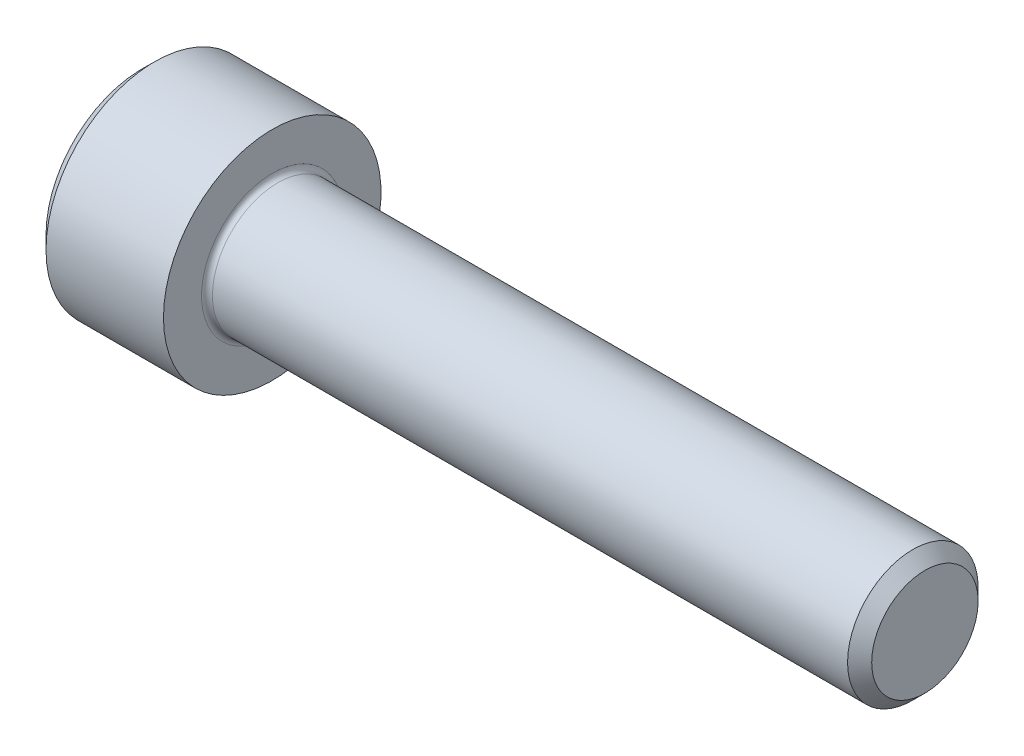
ISO-10303-21;
HEADER;
FILE_DESCRIPTION(('STEP AP214'),'2;1');
FILE_NAME('part.step','',(''),(''),'','','');
FILE_SCHEMA(('AUTOMOTIVE_DESIGN { 1 0 10303 214 1 1 1 1 }'));
ENDSEC;
DATA;
#1=APPLICATION_CONTEXT('core data for automotive mechanical design processes');
#2=APPLICATION_PROTOCOL_DEFINITION('international standard','automotive_design',2000,#1);
#3=PRODUCT_CONTEXT('',#1,'mechanical');
#4=PRODUCT('Part','Part','',(#3));
#5=PRODUCT_RELATED_PRODUCT_CATEGORY('part','',(#4));
#6=PRODUCT_DEFINITION_FORMATION('','',#4);
#7=PRODUCT_DEFINITION_CONTEXT('part definition',#1,'design');
#8=PRODUCT_DEFINITION('design','',#6,#7);
#9=PRODUCT_DEFINITION_SHAPE('','',#8);
#10=(LENGTH_UNIT() NAMED_UNIT(*) SI_UNIT(.MILLI.,.METRE.));
#11=(NAMED_UNIT(*) PLANE_ANGLE_UNIT() SI_UNIT($,.RADIAN.));
#12=(NAMED_UNIT(*) SI_UNIT($,.STERADIAN.) SOLID_ANGLE_UNIT());
#13=UNCERTAINTY_MEASURE_WITH_UNIT(LENGTH_MEASURE(1.E-05),#10,'distance_accuracy_value','');
#14=(GEOMETRIC_REPRESENTATION_CONTEXT(3) GLOBAL_UNCERTAINTY_ASSIGNED_CONTEXT((#13)) GLOBAL_UNIT_ASSIGNED_CONTEXT((#10,
#11,#12)) REPRESENTATION_CONTEXT('',''));
#15=CARTESIAN_POINT('',(0.,0.,0.));
#16=DIRECTION('',(0.,0.,1.));
#17=DIRECTION('',(1.,0.,0.));
#18=AXIS2_PLACEMENT_3D('',#15,#16,#17);
#19=CARTESIAN_POINT('',(0.,0.,0.));
#20=DIRECTION('',(-1.,0.,0.));
#21=DIRECTION('',(0.,0.,1.));
#22=AXIS2_PLACEMENT_3D('',#19,#20,#21);
#23=PLANE('',#22);
#24=DIRECTION('',(0.,-0.5,0.866025403784439));
#25=VECTOR('',#24,1.);
#26=CARTESIAN_POINT('',(0.,2.93524876856006,0.));
#27=LINE('',#26,#25);
#28=CARTESIAN_POINT('',(0.,2.93524876856006,0.));
#29=VERTEX_POINT('',#28);
#30=CARTESIAN_POINT('',(0.,1.46762438428003,2.542));
#31=VERTEX_POINT('',#30);
#32=EDGE_CURVE('E387',#29,#31,#27,.T.);
#33=ORIENTED_EDGE('',*,*,#32,.T.);
#34=DIRECTION('',(0.,1.,0.));
#35=VECTOR('',#34,1.);
#36=CARTESIAN_POINT('',(0.,-1.46762438428003,2.542));
#37=LINE('',#36,#35);
#38=CARTESIAN_POINT('',(0.,-1.46762438428003,2.542));
#39=VERTEX_POINT('',#38);
#40=EDGE_CURVE('E136',#39,#31,#37,.T.);
#41=ORIENTED_EDGE('',*,*,#40,.F.);
#42=DIRECTION('',(0.,-0.500000000000001,-0.866025403784438));
#43=VECTOR('',#42,1.);
#44=CARTESIAN_POINT('',(0.,-1.46762438428003,2.542));
#45=LINE('',#44,#43);
#46=CARTESIAN_POINT('',(0.,-2.93524876856006,0.));
#47=VERTEX_POINT('',#46);
#48=EDGE_CURVE('E390',#39,#47,#45,.T.);
#49=ORIENTED_EDGE('',*,*,#48,.T.);
#50=DIRECTION('',(0.,0.5,-0.866025403784439));
#51=VECTOR('',#50,1.);
#52=CARTESIAN_POINT('',(0.,-2.93524876856006,0.));
#53=LINE('',#52,#51);
#54=CARTESIAN_POINT('',(0.,-1.46762438428003,-2.542));
#55=VERTEX_POINT('',#54);
#56=EDGE_CURVE('E393',#47,#55,#53,.T.);
#57=ORIENTED_EDGE('',*,*,#56,.T.);
#58=DIRECTION('',(0.,-1.,0.));
#59=VECTOR('',#58,1.);
#60=CARTESIAN_POINT('',(0.,1.46762438428003,-2.542));
#61=LINE('',#60,#59);
#62=CARTESIAN_POINT('',(0.,1.46762438428003,-2.542));
#63=VERTEX_POINT('',#62);
#64=EDGE_CURVE('E396',#63,#55,#61,.T.);
#65=ORIENTED_EDGE('',*,*,#64,.F.);
#66=DIRECTION('',(0.,-0.500000000000001,-0.866025403784438));
#67=VECTOR('',#66,1.);
#68=CARTESIAN_POINT('',(0.,2.93524876856006,0.));
#69=LINE('',#68,#67);
#70=EDGE_CURVE('E131',#29,#63,#69,.T.);
#71=ORIENTED_EDGE('',*,*,#70,.F.);
#72=EDGE_LOOP('',(#33,#41,#49,#57,#65,#71));
#73=FACE_BOUND('',#72,.T.);
#74=CARTESIAN_POINT('',(0.,0.,0.));
#75=DIRECTION('',(-1.,0.,0.));
#76=DIRECTION('',(0.,0.,1.));
#77=AXIS2_PLACEMENT_3D('',#74,#75,#76);
#78=CIRCLE('',#77,4.4);
#79=CARTESIAN_POINT('',(0.,0.,4.4));
#80=VERTEX_POINT('',#79);
#81=EDGE_CURVE('E147',#80,#80,#78,.T.);
#82=ORIENTED_EDGE('',*,*,#81,.T.);
#83=EDGE_LOOP('',(#82));
#84=FACE_BOUND('',#83,.T.);
#85=ADVANCED_FACE('F40',(#73,#84),#23,.T.);
#86=CARTESIAN_POINT('',(36.,2.4455,0.));
#87=DIRECTION('',(1.,0.,0.));
#88=DIRECTION('',(0.,0.,-1.));
#89=AXIS2_PLACEMENT_3D('',#86,#87,#88);
#90=PLANE('',#89);
#91=CARTESIAN_POINT('',(36.,0.,0.));
#92=DIRECTION('',(-1.,0.,0.));
#93=DIRECTION('',(0.,0.,1.));
#94=AXIS2_PLACEMENT_3D('',#91,#92,#93);
#95=CIRCLE('',#94,2.4455);
#96=CARTESIAN_POINT('',(36.,0.,2.4455));
#97=VERTEX_POINT('',#96);
#98=EDGE_CURVE('E160',#97,#97,#95,.T.);
#99=ORIENTED_EDGE('',*,*,#98,.F.);
#100=EDGE_LOOP('',(#99));
#101=FACE_BOUND('',#100,.T.);
#102=ADVANCED_FACE('F182',(#101),#90,.T.);
#103=CARTESIAN_POINT('',(36.,0.,0.));
#104=DIRECTION('',(-1.,0.,0.));
#105=DIRECTION('',(0.,0.,1.));
#106=AXIS2_PLACEMENT_3D('',#103,#104,#105);
#107=CONICAL_SURFACE('',#106,2.4455,0.785398163397553);
#108=CARTESIAN_POINT('',(35.4455000000001,0.,0.));
#109=DIRECTION('',(-1.,0.,0.));
#110=DIRECTION('',(0.,0.,1.));
#111=AXIS2_PLACEMENT_3D('',#108,#109,#110);
#112=CIRCLE('',#111,3.00000000000005);
#113=CARTESIAN_POINT('',(35.4455000000001,0.,3.00000000000005));
#114=VERTEX_POINT('',#113);
#115=EDGE_CURVE('E157',#114,#114,#112,.T.);
#116=ORIENTED_EDGE('',*,*,#115,.F.);
#117=EDGE_LOOP('',(#116));
#118=FACE_BOUND('',#117,.T.);
#119=ORIENTED_EDGE('',*,*,#98,.T.);
#120=EDGE_LOOP('',(#119));
#121=FACE_BOUND('',#120,.T.);
#122=ADVANCED_FACE('F188',(#118,#121),#107,.T.);
#123=CARTESIAN_POINT('',(-31.75,0.,0.));
#124=DIRECTION('',(-1.,0.,0.));
#125=DIRECTION('',(0.,0.,1.));
#126=AXIS2_PLACEMENT_3D('',#123,#124,#125);
#127=CYLINDRICAL_SURFACE('',#126,3.00000000000002);
#128=CARTESIAN_POINT('',(6.25,0.,0.));
#129=DIRECTION('',(1.,0.,0.));
#130=DIRECTION('',(0.,0.,-1.));
#131=AXIS2_PLACEMENT_3D('',#128,#129,#130);
#132=CIRCLE('',#131,3.00000000000002);
#133=CARTESIAN_POINT('',(6.25,0.,-3.00000000000002));
#134=VERTEX_POINT('',#133);
#135=EDGE_CURVE('E11',#134,#134,#132,.T.);
#136=ORIENTED_EDGE('',*,*,#135,.T.);
#137=EDGE_LOOP('',(#136));
#138=FACE_BOUND('',#137,.T.);
#139=ORIENTED_EDGE('',*,*,#115,.T.);
#140=EDGE_LOOP('',(#139));
#141=FACE_BOUND('',#140,.T.);
#142=ADVANCED_FACE('F198',(#138,#141),#127,.T.);
#143=CARTESIAN_POINT('',(6.,5.,0.));
#144=DIRECTION('',(1.,0.,0.));
#145=DIRECTION('',(0.,0.,-1.));
#146=AXIS2_PLACEMENT_3D('',#143,#144,#145);
#147=PLANE('',#146);
#148=CARTESIAN_POINT('',(6.,0.,0.));
#149=DIRECTION('',(1.,0.,0.));
#150=DIRECTION('',(0.,0.,-1.));
#151=AXIS2_PLACEMENT_3D('',#148,#149,#150);
#152=CIRCLE('',#151,3.25000000000002);
#153=CARTESIAN_POINT('',(6.,0.,-3.25000000000002));
#154=VERTEX_POINT('',#153);
#155=EDGE_CURVE('E48',#154,#154,#152,.F.);
#156=ORIENTED_EDGE('',*,*,#155,.T.);
#157=EDGE_LOOP('',(#156));
#158=FACE_BOUND('',#157,.T.);
#159=CARTESIAN_POINT('',(6.,0.,0.));
#160=DIRECTION('',(-1.,0.,0.));
#161=DIRECTION('',(0.,0.,1.));
#162=AXIS2_PLACEMENT_3D('',#159,#160,#161);
#163=CIRCLE('',#162,5.);
#164=CARTESIAN_POINT('',(6.,0.,5.));
#165=VERTEX_POINT('',#164);
#166=EDGE_CURVE('E154',#165,#165,#163,.T.);
#167=ORIENTED_EDGE('',*,*,#166,.F.);
#168=EDGE_LOOP('',(#167));
#169=FACE_BOUND('',#168,.T.);
#170=ADVANCED_FACE('F165',(#158,#169),#147,.T.);
#171=CARTESIAN_POINT('',(-31.75,0.,0.));
#172=DIRECTION('',(-1.,0.,0.));
#173=DIRECTION('',(0.,0.,1.));
#174=AXIS2_PLACEMENT_3D('',#171,#172,#173);
#175=CYLINDRICAL_SURFACE('',#174,5.);
#176=ORIENTED_EDGE('',*,*,#166,.T.);
#177=EDGE_LOOP('',(#176));
#178=FACE_BOUND('',#177,.T.);
#179=CARTESIAN_POINT('',(0.600000000000003,0.,0.));
#180=DIRECTION('',(-1.,0.,0.));
#181=DIRECTION('',(0.,0.,1.));
#182=AXIS2_PLACEMENT_3D('',#179,#180,#181);
#183=CIRCLE('',#182,5.);
#184=CARTESIAN_POINT('',(0.600000000000003,0.,5.));
#185=VERTEX_POINT('',#184);
#186=EDGE_CURVE('E151',#185,#185,#183,.T.);
#187=ORIENTED_EDGE('',*,*,#186,.F.);
#188=EDGE_LOOP('',(#187));
#189=FACE_BOUND('',#188,.T.);
#190=ADVANCED_FACE('F178',(#178,#189),#175,.T.);
#191=CARTESIAN_POINT('',(0.,0.,0.));
#192=DIRECTION('',(1.,0.,0.));
#193=DIRECTION('',(0.,0.,-1.));
#194=AXIS2_PLACEMENT_3D('',#191,#192,#193);
#195=CONICAL_SURFACE('',#194,4.4,0.785398163397446);
#196=ORIENTED_EDGE('',*,*,#186,.T.);
#197=EDGE_LOOP('',(#196));
#198=FACE_BOUND('',#197,.T.);
#199=ORIENTED_EDGE('',*,*,#81,.F.);
#200=EDGE_LOOP('',(#199));
#201=FACE_BOUND('',#200,.T.);
#202=ADVANCED_FACE('F169',(#198,#201),#195,.T.);
#203=CARTESIAN_POINT('',(6.25,0.,0.));
#204=DIRECTION('',(1.,0.,0.));
#205=DIRECTION('',(0.,0.,-1.));
#206=AXIS2_PLACEMENT_3D('',#203,#204,#205);
#207=TOROIDAL_SURFACE('',#206,3.25000000000002,0.25);
#208=ORIENTED_EDGE('',*,*,#135,.F.);
#209=EDGE_LOOP('',(#208));
#210=FACE_BOUND('',#209,.T.);
#211=ORIENTED_EDGE('',*,*,#155,.F.);
#212=EDGE_LOOP('',(#211));
#213=FACE_BOUND('',#212,.T.);
#214=ADVANCED_FACE('F42',(#210,#213),#207,.F.);
#215=CARTESIAN_POINT('',(3.,2.93524876856006,0.));
#216=DIRECTION('',(0.,-0.866025403784439,-0.5));
#217=DIRECTION('',(0.,0.5,-0.866025403784439));
#218=AXIS2_PLACEMENT_3D('',#215,#216,#217);
#219=PLANE('',#218);
#220=ORIENTED_EDGE('',*,*,#32,.F.);
#221=DIRECTION('',(-1.,0.,0.));
#222=VECTOR('',#221,1.);
#223=CARTESIAN_POINT('',(3.,2.93524876856006,0.));
#224=LINE('',#223,#222);
#225=CARTESIAN_POINT('',(3.,2.93524876856006,0.));
#226=VERTEX_POINT('',#225);
#227=EDGE_CURVE('E377',#226,#29,#224,.T.);
#228=ORIENTED_EDGE('',*,*,#227,.F.);
#229=DIRECTION('',(0.,-0.5,0.866025403784439));
#230=VECTOR('',#229,1.);
#231=CARTESIAN_POINT('',(3.,2.93524876856006,0.));
#232=LINE('',#231,#230);
#233=CARTESIAN_POINT('',(3.,2.20143657642004,1.271));
#234=VERTEX_POINT('',#233);
#235=EDGE_CURVE('E123',#226,#234,#232,.T.);
#236=ORIENTED_EDGE('',*,*,#235,.T.);
#237=CARTESIAN_POINT('',(3.,1.46762438428003,2.542));
#238=VERTEX_POINT('',#237);
#239=EDGE_CURVE('E114',#234,#238,#232,.T.);
#240=ORIENTED_EDGE('',*,*,#239,.T.);
#241=DIRECTION('',(-1.,0.,0.));
#242=VECTOR('',#241,1.);
#243=CARTESIAN_POINT('',(3.,1.46762438428003,2.542));
#244=LINE('',#243,#242);
#245=EDGE_CURVE('E128',#238,#31,#244,.T.);
#246=ORIENTED_EDGE('',*,*,#245,.T.);
#247=EDGE_LOOP('',(#220,#228,#236,#240,#246));
#248=FACE_BOUND('',#247,.T.);
#249=ADVANCED_FACE('F127',(#248),#219,.T.);
#250=CARTESIAN_POINT('',(3.,-1.46762438428003,2.542));
#251=DIRECTION('',(0.,0.,1.));
#252=DIRECTION('',(0.,-1.,0.));
#253=AXIS2_PLACEMENT_3D('',#250,#251,#252);
#254=PLANE('',#253);
#255=ORIENTED_EDGE('',*,*,#40,.T.);
#256=ORIENTED_EDGE('',*,*,#245,.F.);
#257=DIRECTION('',(0.,1.,0.));
#258=VECTOR('',#257,1.);
#259=CARTESIAN_POINT('',(3.,-1.46762438428003,2.542));
#260=LINE('',#259,#258);
#261=CARTESIAN_POINT('',(3.,0.,2.542));
#262=VERTEX_POINT('',#261);
#263=EDGE_CURVE('E111',#262,#238,#260,.T.);
#264=ORIENTED_EDGE('',*,*,#263,.F.);
#265=CARTESIAN_POINT('',(3.,-1.46762438428003,2.542));
#266=VERTEX_POINT('',#265);
#267=EDGE_CURVE('E122',#266,#262,#260,.T.);
#268=ORIENTED_EDGE('',*,*,#267,.F.);
#269=DIRECTION('',(-1.,0.,0.));
#270=VECTOR('',#269,1.);
#271=CARTESIAN_POINT('',(3.,-1.46762438428003,2.542));
#272=LINE('',#271,#270);
#273=EDGE_CURVE('E138',#266,#39,#272,.T.);
#274=ORIENTED_EDGE('',*,*,#273,.T.);
#275=EDGE_LOOP('',(#255,#256,#264,#268,#274));
#276=FACE_BOUND('',#275,.T.);
#277=ADVANCED_FACE('F133',(#276),#254,.F.);
#278=CARTESIAN_POINT('',(3.,-1.46762438428003,2.542));
#279=DIRECTION('',(0.,0.866025403784438,-0.500000000000001));
#280=DIRECTION('',(0.,0.500000000000001,0.866025403784438));
#281=AXIS2_PLACEMENT_3D('',#278,#279,#280);
#282=PLANE('',#281);
#283=ORIENTED_EDGE('',*,*,#48,.F.);
#284=ORIENTED_EDGE('',*,*,#273,.F.);
#285=DIRECTION('',(0.,-0.500000000000001,-0.866025403784438));
#286=VECTOR('',#285,1.);
#287=CARTESIAN_POINT('',(3.,-1.46762438428003,2.542));
#288=LINE('',#287,#286);
#289=CARTESIAN_POINT('',(3.,-2.20143657642004,1.271));
#290=VERTEX_POINT('',#289);
#291=EDGE_CURVE('E416',#266,#290,#288,.T.);
#292=ORIENTED_EDGE('',*,*,#291,.T.);
#293=CARTESIAN_POINT('',(3.,-2.93524876856006,0.));
#294=VERTEX_POINT('',#293);
#295=EDGE_CURVE('E405',#290,#294,#288,.T.);
#296=ORIENTED_EDGE('',*,*,#295,.T.);
#297=DIRECTION('',(-1.,0.,0.));
#298=VECTOR('',#297,1.);
#299=CARTESIAN_POINT('',(3.,-2.93524876856006,0.));
#300=LINE('',#299,#298);
#301=EDGE_CURVE('E143',#294,#47,#300,.T.);
#302=ORIENTED_EDGE('',*,*,#301,.T.);
#303=EDGE_LOOP('',(#283,#284,#292,#296,#302));
#304=FACE_BOUND('',#303,.T.);
#305=ADVANCED_FACE('F266',(#304),#282,.T.);
#306=CARTESIAN_POINT('',(3.,-2.93524876856006,0.));
#307=DIRECTION('',(0.,0.866025403784439,0.5));
#308=DIRECTION('',(0.,-0.5,0.866025403784439));
#309=AXIS2_PLACEMENT_3D('',#306,#307,#308);
#310=PLANE('',#309);
#311=ORIENTED_EDGE('',*,*,#56,.F.);
#312=ORIENTED_EDGE('',*,*,#301,.F.);
#313=DIRECTION('',(0.,0.5,-0.866025403784439));
#314=VECTOR('',#313,1.);
#315=CARTESIAN_POINT('',(3.,-2.93524876856006,0.));
#316=LINE('',#315,#314);
#317=CARTESIAN_POINT('',(3.,-2.20143657642004,-1.271));
#318=VERTEX_POINT('',#317);
#319=EDGE_CURVE('E383',#294,#318,#316,.T.);
#320=ORIENTED_EDGE('',*,*,#319,.T.);
#321=CARTESIAN_POINT('',(3.,-1.46762438428003,-2.542));
#322=VERTEX_POINT('',#321);
#323=EDGE_CURVE('E415',#318,#322,#316,.T.);
#324=ORIENTED_EDGE('',*,*,#323,.T.);
#325=DIRECTION('',(-1.,0.,0.));
#326=VECTOR('',#325,1.);
#327=CARTESIAN_POINT('',(3.,-1.46762438428003,-2.542));
#328=LINE('',#327,#326);
#329=EDGE_CURVE('E376',#322,#55,#328,.T.);
#330=ORIENTED_EDGE('',*,*,#329,.T.);
#331=EDGE_LOOP('',(#311,#312,#320,#324,#330));
#332=FACE_BOUND('',#331,.T.);
#333=ADVANCED_FACE('F274',(#332),#310,.T.);
#334=CARTESIAN_POINT('',(3.,1.46762438428003,-2.542));
#335=DIRECTION('',(0.,0.,-1.));
#336=DIRECTION('',(0.,1.,0.));
#337=AXIS2_PLACEMENT_3D('',#334,#335,#336);
#338=PLANE('',#337);
#339=ORIENTED_EDGE('',*,*,#64,.T.);
#340=ORIENTED_EDGE('',*,*,#329,.F.);
#341=DIRECTION('',(0.,-1.,0.));
#342=VECTOR('',#341,1.);
#343=CARTESIAN_POINT('',(3.,1.46762438428003,-2.542));
#344=LINE('',#343,#342);
#345=CARTESIAN_POINT('',(3.,0.,-2.542));
#346=VERTEX_POINT('',#345);
#347=EDGE_CURVE('E380',#346,#322,#344,.T.);
#348=ORIENTED_EDGE('',*,*,#347,.F.);
#349=CARTESIAN_POINT('',(3.,1.46762438428003,-2.542));
#350=VERTEX_POINT('',#349);
#351=EDGE_CURVE('E55',#350,#346,#344,.T.);
#352=ORIENTED_EDGE('',*,*,#351,.F.);
#353=DIRECTION('',(-1.,0.,0.));
#354=VECTOR('',#353,1.);
#355=CARTESIAN_POINT('',(3.,1.46762438428003,-2.542));
#356=LINE('',#355,#354);
#357=EDGE_CURVE('E373',#350,#63,#356,.T.);
#358=ORIENTED_EDGE('',*,*,#357,.T.);
#359=EDGE_LOOP('',(#339,#340,#348,#352,#358));
#360=FACE_BOUND('',#359,.T.);
#361=ADVANCED_FACE('F283',(#360),#338,.F.);
#362=CARTESIAN_POINT('',(3.,2.93524876856006,0.));
#363=DIRECTION('',(0.,0.866025403784438,-0.500000000000001));
#364=DIRECTION('',(0.,0.500000000000001,0.866025403784438));
#365=AXIS2_PLACEMENT_3D('',#362,#363,#364);
#366=PLANE('',#365);
#367=ORIENTED_EDGE('',*,*,#70,.T.);
#368=ORIENTED_EDGE('',*,*,#357,.F.);
#369=DIRECTION('',(0.,-0.500000000000001,-0.866025403784438));
#370=VECTOR('',#369,1.);
#371=CARTESIAN_POINT('',(3.,2.93524876856006,0.));
#372=LINE('',#371,#370);
#373=CARTESIAN_POINT('',(3.,2.20143657642004,-1.271));
#374=VERTEX_POINT('',#373);
#375=EDGE_CURVE('E363',#374,#350,#372,.T.);
#376=ORIENTED_EDGE('',*,*,#375,.F.);
#377=EDGE_CURVE('E369',#226,#374,#372,.T.);
#378=ORIENTED_EDGE('',*,*,#377,.F.);
#379=ORIENTED_EDGE('',*,*,#227,.T.);
#380=EDGE_LOOP('',(#367,#368,#376,#378,#379));
#381=FACE_BOUND('',#380,.T.);
#382=ADVANCED_FACE('F292',(#381),#366,.F.);
#383=CARTESIAN_POINT('',(3.,2.93524876856006,0.));
#384=DIRECTION('',(1.,0.,0.));
#385=DIRECTION('',(0.,0.,-1.));
#386=AXIS2_PLACEMENT_3D('',#383,#384,#385);
#387=PLANE('',#386);
#388=ORIENTED_EDGE('',*,*,#347,.T.);
#389=ORIENTED_EDGE('',*,*,#323,.F.);
#390=CARTESIAN_POINT('',(3.,0.,0.));
#391=DIRECTION('',(-1.,0.,0.));
#392=DIRECTION('',(0.,0.,1.));
#393=AXIS2_PLACEMENT_3D('',#390,#391,#392);
#394=CIRCLE('',#393,2.542);
#395=EDGE_CURVE('E411',#346,#318,#394,.T.);
#396=ORIENTED_EDGE('',*,*,#395,.F.);
#397=EDGE_LOOP('',(#388,#389,#396));
#398=FACE_BOUND('',#397,.T.);
#399=ADVANCED_FACE('F301',(#398),#387,.F.);
#400=ORIENTED_EDGE('',*,*,#319,.F.);
#401=ORIENTED_EDGE('',*,*,#295,.F.);
#402=EDGE_CURVE('E141',#318,#290,#394,.T.);
#403=ORIENTED_EDGE('',*,*,#402,.F.);
#404=EDGE_LOOP('',(#400,#401,#403));
#405=FACE_BOUND('',#404,.T.);
#406=ADVANCED_FACE('F310',(#405),#387,.F.);
#407=ORIENTED_EDGE('',*,*,#291,.F.);
#408=ORIENTED_EDGE('',*,*,#267,.T.);
#409=EDGE_CURVE('E137',#290,#262,#394,.T.);
#410=ORIENTED_EDGE('',*,*,#409,.F.);
#411=EDGE_LOOP('',(#407,#408,#410));
#412=FACE_BOUND('',#411,.T.);
#413=ADVANCED_FACE('F319',(#412),#387,.F.);
#414=ORIENTED_EDGE('',*,*,#263,.T.);
#415=ORIENTED_EDGE('',*,*,#239,.F.);
#416=EDGE_CURVE('E117',#262,#234,#394,.T.);
#417=ORIENTED_EDGE('',*,*,#416,.F.);
#418=EDGE_LOOP('',(#414,#415,#417));
#419=FACE_BOUND('',#418,.T.);
#420=ADVANCED_FACE('F113',(#419),#387,.F.);
#421=ORIENTED_EDGE('',*,*,#235,.F.);
#422=ORIENTED_EDGE('',*,*,#377,.T.);
#423=EDGE_CURVE('E148',#234,#374,#394,.T.);
#424=ORIENTED_EDGE('',*,*,#423,.F.);
#425=EDGE_LOOP('',(#421,#422,#424));
#426=FACE_BOUND('',#425,.T.);
#427=ADVANCED_FACE('F334',(#426),#387,.F.);
#428=ORIENTED_EDGE('',*,*,#375,.T.);
#429=ORIENTED_EDGE('',*,*,#351,.T.);
#430=EDGE_CURVE('E366',#374,#346,#394,.T.);
#431=ORIENTED_EDGE('',*,*,#430,.F.);
#432=EDGE_LOOP('',(#428,#429,#431));
#433=FACE_BOUND('',#432,.T.);
#434=ADVANCED_FACE('F249',(#433),#387,.F.);
#435=CARTESIAN_POINT('',(3.,0.,0.));
#436=DIRECTION('',(-1.,0.,0.));
#437=DIRECTION('',(0.,0.,1.));
#438=AXIS2_PLACEMENT_3D('',#435,#436,#437);
#439=CONICAL_SURFACE('',#438,2.542,1.04719755119659);
#440=CARTESIAN_POINT('',(4.46762438428004,0.,0.));
#441=VERTEX_POINT('',#440);
#442=VERTEX_LOOP('',#441);
#443=FACE_BOUND('',#442,.T.);
#444=ORIENTED_EDGE('',*,*,#416,.T.);
#445=ORIENTED_EDGE('',*,*,#423,.T.);
#446=ORIENTED_EDGE('',*,*,#430,.T.);
#447=ORIENTED_EDGE('',*,*,#395,.T.);
#448=ORIENTED_EDGE('',*,*,#402,.T.);
#449=ORIENTED_EDGE('',*,*,#409,.T.);
#450=EDGE_LOOP('',(#444,#445,#446,#447,#448,#449));
#451=FACE_BOUND('',#450,.T.);
#452=ADVANCED_FACE('F192',(#443,#451),#439,.F.);
#453=CLOSED_SHELL('',(#85,#102,#122,#142,#170,#190,#202,#214,#249,#277,#305,#333,#361,#382,#399,
#406,#413,#420,#427,#434,#452));
#454=MANIFOLD_SOLID_BREP('B2',#453);
#455=ADVANCED_BREP_SHAPE_REPRESENTATION('',(#18,#454),#14);
#456=SHAPE_DEFINITION_REPRESENTATION(#9,#455);
ENDSEC;
END-ISO-10303-21;
